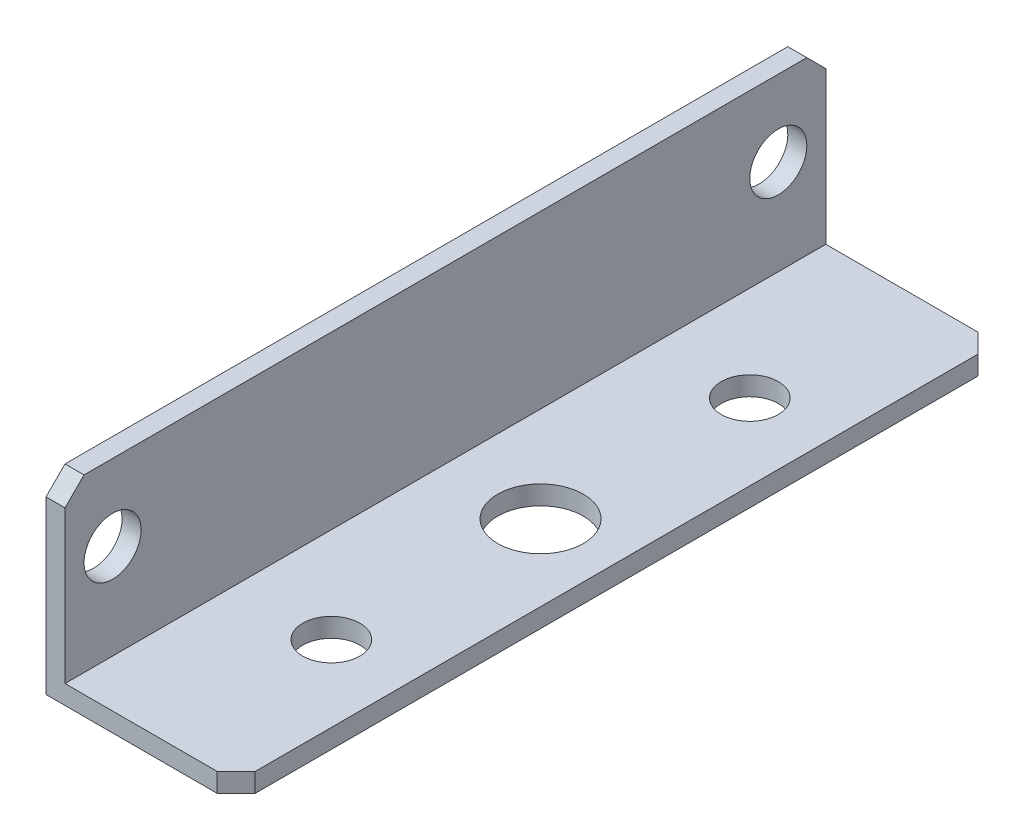
ISO-10303-21;
HEADER;
FILE_DESCRIPTION(('STEP AP214'),'2;1');
FILE_NAME('part.step','',(''),(''),'','','');
FILE_SCHEMA(('AUTOMOTIVE_DESIGN { 1 0 10303 214 1 1 1 1 }'));
ENDSEC;
DATA;
#1=APPLICATION_CONTEXT('core data for automotive mechanical design processes');
#2=APPLICATION_PROTOCOL_DEFINITION('international standard','automotive_design',2000,#1);
#3=PRODUCT_CONTEXT('',#1,'mechanical');
#4=PRODUCT('Part','Part','',(#3));
#5=PRODUCT_RELATED_PRODUCT_CATEGORY('part','',(#4));
#6=PRODUCT_DEFINITION_FORMATION('','',#4);
#7=PRODUCT_DEFINITION_CONTEXT('part definition',#1,'design');
#8=PRODUCT_DEFINITION('design','',#6,#7);
#9=PRODUCT_DEFINITION_SHAPE('','',#8);
#10=(LENGTH_UNIT() NAMED_UNIT(*) SI_UNIT(.MILLI.,.METRE.));
#11=(NAMED_UNIT(*) PLANE_ANGLE_UNIT() SI_UNIT($,.RADIAN.));
#12=(NAMED_UNIT(*) SI_UNIT($,.STERADIAN.) SOLID_ANGLE_UNIT());
#13=UNCERTAINTY_MEASURE_WITH_UNIT(LENGTH_MEASURE(1.E-05),#10,'distance_accuracy_value','');
#14=(GEOMETRIC_REPRESENTATION_CONTEXT(3) GLOBAL_UNCERTAINTY_ASSIGNED_CONTEXT((#13)) GLOBAL_UNIT_ASSIGNED_CONTEXT((#10,
#11,#12)) REPRESENTATION_CONTEXT('',''));
#15=CARTESIAN_POINT('',(0.,0.,0.));
#16=DIRECTION('',(0.,0.,1.));
#17=DIRECTION('',(1.,0.,0.));
#18=AXIS2_PLACEMENT_3D('',#15,#16,#17);
#19=CARTESIAN_POINT('',(0.,0.,20.));
#20=DIRECTION('',(0.,1.,0.));
#21=DIRECTION('',(0.,0.,1.));
#22=AXIS2_PLACEMENT_3D('',#19,#20,#21);
#23=PLANE('',#22);
#24=CARTESIAN_POINT('',(6.,0.,0.));
#25=DIRECTION('',(0.,1.,0.));
#26=DIRECTION('',(0.,0.,1.));
#27=AXIS2_PLACEMENT_3D('',#24,#25,#26);
#28=CIRCLE('',#27,2.25);
#29=CARTESIAN_POINT('',(6.,0.,2.25));
#30=VERTEX_POINT('',#29);
#31=EDGE_CURVE('E215',#30,#30,#28,.T.);
#32=ORIENTED_EDGE('',*,*,#31,.T.);
#33=EDGE_LOOP('',(#32));
#34=FACE_BOUND('',#33,.T.);
#35=CARTESIAN_POINT('',(6.,0.,-11.));
#36=DIRECTION('',(0.,1.,0.));
#37=DIRECTION('',(0.,0.,1.));
#38=AXIS2_PLACEMENT_3D('',#35,#36,#37);
#39=CIRCLE('',#38,1.5);
#40=CARTESIAN_POINT('',(6.,0.,-9.5));
#41=VERTEX_POINT('',#40);
#42=EDGE_CURVE('E209',#41,#41,#39,.T.);
#43=ORIENTED_EDGE('',*,*,#42,.T.);
#44=EDGE_LOOP('',(#43));
#45=FACE_BOUND('',#44,.T.);
#46=CARTESIAN_POINT('',(6.,0.,11.));
#47=DIRECTION('',(0.,1.,0.));
#48=DIRECTION('',(0.,0.,1.));
#49=AXIS2_PLACEMENT_3D('',#46,#47,#48);
#50=CIRCLE('',#49,1.5);
#51=CARTESIAN_POINT('',(6.,0.,12.5));
#52=VERTEX_POINT('',#51);
#53=EDGE_CURVE('E203',#52,#52,#50,.T.);
#54=ORIENTED_EDGE('',*,*,#53,.T.);
#55=EDGE_LOOP('',(#54));
#56=FACE_BOUND('',#55,.T.);
#57=DIRECTION('',(1.,0.,0.));
#58=VECTOR('',#57,1.);
#59=CARTESIAN_POINT('',(0.,0.,-20.));
#60=LINE('',#59,#58);
#61=CARTESIAN_POINT('',(0.,0.,-20.));
#62=VERTEX_POINT('',#61);
#63=CARTESIAN_POINT('',(9.,0.,-20.));
#64=VERTEX_POINT('',#63);
#65=EDGE_CURVE('E143',#62,#64,#60,.T.);
#66=ORIENTED_EDGE('',*,*,#65,.T.);
#67=DIRECTION('',(-0.707106781186545,0.,-0.70710678118655));
#68=VECTOR('',#67,1.);
#69=CARTESIAN_POINT('',(9.,0.,-20.));
#70=LINE('',#69,#68);
#71=CARTESIAN_POINT('',(10.,0.,-19.));
#72=VERTEX_POINT('',#71);
#73=EDGE_CURVE('E181',#64,#72,#70,.F.);
#74=ORIENTED_EDGE('',*,*,#73,.T.);
#75=DIRECTION('',(0.,0.,-1.));
#76=VECTOR('',#75,1.);
#77=CARTESIAN_POINT('',(10.,0.,20.));
#78=LINE('',#77,#76);
#79=CARTESIAN_POINT('',(10.,0.,19.));
#80=VERTEX_POINT('',#79);
#81=EDGE_CURVE('E159',#80,#72,#78,.T.);
#82=ORIENTED_EDGE('',*,*,#81,.F.);
#83=DIRECTION('',(-0.707106781186549,0.,0.707106781186546));
#84=VECTOR('',#83,1.);
#85=CARTESIAN_POINT('',(10.,0.,19.));
#86=LINE('',#85,#84);
#87=CARTESIAN_POINT('',(8.99999999999999,0.,20.));
#88=VERTEX_POINT('',#87);
#89=EDGE_CURVE('E179',#80,#88,#86,.T.);
#90=ORIENTED_EDGE('',*,*,#89,.T.);
#91=DIRECTION('',(1.,0.,0.));
#92=VECTOR('',#91,1.);
#93=CARTESIAN_POINT('',(0.,0.,20.));
#94=LINE('',#93,#92);
#95=CARTESIAN_POINT('',(0.,0.,20.));
#96=VERTEX_POINT('',#95);
#97=EDGE_CURVE('E135',#96,#88,#94,.T.);
#98=ORIENTED_EDGE('',*,*,#97,.F.);
#99=DIRECTION('',(0.,0.,-1.));
#100=VECTOR('',#99,1.);
#101=CARTESIAN_POINT('',(0.,0.,20.));
#102=LINE('',#101,#100);
#103=EDGE_CURVE('E142',#96,#62,#102,.T.);
#104=ORIENTED_EDGE('',*,*,#103,.T.);
#105=EDGE_LOOP('',(#66,#74,#82,#90,#98,#104));
#106=FACE_BOUND('',#105,.T.);
#107=ADVANCED_FACE('F33',(#34,#45,#56,#106),#23,.F.);
#108=CARTESIAN_POINT('',(10.,1.,20.));
#109=DIRECTION('',(1.,0.,0.));
#110=DIRECTION('',(0.,0.,-1.));
#111=AXIS2_PLACEMENT_3D('',#108,#109,#110);
#112=PLANE('',#111);
#113=ORIENTED_EDGE('',*,*,#81,.T.);
#114=DIRECTION('',(0.,1.,0.));
#115=VECTOR('',#114,1.);
#116=CARTESIAN_POINT('',(10.,1.,-19.));
#117=LINE('',#116,#115);
#118=CARTESIAN_POINT('',(10.,1.,-19.));
#119=VERTEX_POINT('',#118);
#120=EDGE_CURVE('E56',#72,#119,#117,.T.);
#121=ORIENTED_EDGE('',*,*,#120,.T.);
#122=DIRECTION('',(0.,0.,-1.));
#123=VECTOR('',#122,1.);
#124=CARTESIAN_POINT('',(10.,1.,20.));
#125=LINE('',#124,#123);
#126=CARTESIAN_POINT('',(10.,1.,19.));
#127=VERTEX_POINT('',#126);
#128=EDGE_CURVE('E131',#127,#119,#125,.T.);
#129=ORIENTED_EDGE('',*,*,#128,.F.);
#130=DIRECTION('',(0.,-1.,0.));
#131=VECTOR('',#130,1.);
#132=CARTESIAN_POINT('',(10.,0.,19.));
#133=LINE('',#132,#131);
#134=EDGE_CURVE('E183',#127,#80,#133,.T.);
#135=ORIENTED_EDGE('',*,*,#134,.T.);
#136=EDGE_LOOP('',(#113,#121,#129,#135));
#137=FACE_BOUND('',#136,.T.);
#138=ADVANCED_FACE('F227',(#137),#112,.T.);
#139=CARTESIAN_POINT('',(0.,1.,20.));
#140=DIRECTION('',(0.,1.,0.));
#141=DIRECTION('',(0.,0.,1.));
#142=AXIS2_PLACEMENT_3D('',#139,#140,#141);
#143=PLANE('',#142);
#144=CARTESIAN_POINT('',(6.,1.,0.));
#145=DIRECTION('',(0.,1.,0.));
#146=DIRECTION('',(0.,0.,1.));
#147=AXIS2_PLACEMENT_3D('',#144,#145,#146);
#148=CIRCLE('',#147,2.25);
#149=CARTESIAN_POINT('',(6.,1.,2.25));
#150=VERTEX_POINT('',#149);
#151=EDGE_CURVE('E218',#150,#150,#148,.T.);
#152=ORIENTED_EDGE('',*,*,#151,.F.);
#153=EDGE_LOOP('',(#152));
#154=FACE_BOUND('',#153,.T.);
#155=CARTESIAN_POINT('',(6.,1.,-11.));
#156=DIRECTION('',(0.,1.,0.));
#157=DIRECTION('',(0.,0.,1.));
#158=AXIS2_PLACEMENT_3D('',#155,#156,#157);
#159=CIRCLE('',#158,1.5);
#160=CARTESIAN_POINT('',(6.,1.,-9.5));
#161=VERTEX_POINT('',#160);
#162=EDGE_CURVE('E212',#161,#161,#159,.T.);
#163=ORIENTED_EDGE('',*,*,#162,.F.);
#164=EDGE_LOOP('',(#163));
#165=FACE_BOUND('',#164,.T.);
#166=CARTESIAN_POINT('',(6.,1.,11.));
#167=DIRECTION('',(0.,1.,0.));
#168=DIRECTION('',(0.,0.,1.));
#169=AXIS2_PLACEMENT_3D('',#166,#167,#168);
#170=CIRCLE('',#169,1.5);
#171=CARTESIAN_POINT('',(6.,1.,12.5));
#172=VERTEX_POINT('',#171);
#173=EDGE_CURVE('E206',#172,#172,#170,.T.);
#174=ORIENTED_EDGE('',*,*,#173,.F.);
#175=EDGE_LOOP('',(#174));
#176=FACE_BOUND('',#175,.T.);
#177=ORIENTED_EDGE('',*,*,#128,.T.);
#178=DIRECTION('',(0.707106781186545,0.,0.70710678118655));
#179=VECTOR('',#178,1.);
#180=CARTESIAN_POINT('',(24.5,1.,-4.49999999999986));
#181=LINE('',#180,#179);
#182=CARTESIAN_POINT('',(8.99999999999999,1.,-20.));
#183=VERTEX_POINT('',#182);
#184=EDGE_CURVE('E189',#119,#183,#181,.F.);
#185=ORIENTED_EDGE('',*,*,#184,.T.);
#186=DIRECTION('',(1.,0.,0.));
#187=VECTOR('',#186,1.);
#188=CARTESIAN_POINT('',(0.,1.,-20.));
#189=LINE('',#188,#187);
#190=CARTESIAN_POINT('',(1.,1.,-20.));
#191=VERTEX_POINT('',#190);
#192=EDGE_CURVE('E130',#191,#183,#189,.T.);
#193=ORIENTED_EDGE('',*,*,#192,.F.);
#194=DIRECTION('',(0.,0.,-1.));
#195=VECTOR('',#194,1.);
#196=CARTESIAN_POINT('',(1.,1.,20.));
#197=LINE('',#196,#195);
#198=CARTESIAN_POINT('',(1.,1.,20.));
#199=VERTEX_POINT('',#198);
#200=EDGE_CURVE('E118',#199,#191,#197,.T.);
#201=ORIENTED_EDGE('',*,*,#200,.F.);
#202=DIRECTION('',(1.,0.,0.));
#203=VECTOR('',#202,1.);
#204=CARTESIAN_POINT('',(0.,1.,20.));
#205=LINE('',#204,#203);
#206=CARTESIAN_POINT('',(8.99999999999999,1.,20.));
#207=VERTEX_POINT('',#206);
#208=EDGE_CURVE('E124',#199,#207,#205,.T.);
#209=ORIENTED_EDGE('',*,*,#208,.T.);
#210=DIRECTION('',(0.707106781186549,0.,-0.707106781186546));
#211=VECTOR('',#210,1.);
#212=CARTESIAN_POINT('',(4.49999999999998,1.,24.5));
#213=LINE('',#212,#211);
#214=EDGE_CURVE('E187',#207,#127,#213,.T.);
#215=ORIENTED_EDGE('',*,*,#214,.T.);
#216=EDGE_LOOP('',(#177,#185,#193,#201,#209,#215));
#217=FACE_BOUND('',#216,.T.);
#218=ADVANCED_FACE('F127',(#154,#165,#176,#217),#143,.T.);
#219=CARTESIAN_POINT('',(1.,10.,20.));
#220=DIRECTION('',(1.,0.,0.));
#221=DIRECTION('',(0.,1.,0.));
#222=AXIS2_PLACEMENT_3D('',#219,#220,#221);
#223=PLANE('',#222);
#224=CARTESIAN_POINT('',(1.,6.,-17.5));
#225=DIRECTION('',(1.,0.,0.));
#226=DIRECTION('',(0.,1.,0.));
#227=AXIS2_PLACEMENT_3D('',#224,#225,#226);
#228=CIRCLE('',#227,1.5);
#229=CARTESIAN_POINT('',(1.,7.5,-17.5));
#230=VERTEX_POINT('',#229);
#231=EDGE_CURVE('E199',#230,#230,#228,.T.);
#232=ORIENTED_EDGE('',*,*,#231,.F.);
#233=EDGE_LOOP('',(#232));
#234=FACE_BOUND('',#233,.T.);
#235=CARTESIAN_POINT('',(1.,6.,17.5));
#236=DIRECTION('',(1.,0.,0.));
#237=DIRECTION('',(0.,1.,0.));
#238=AXIS2_PLACEMENT_3D('',#235,#236,#237);
#239=CIRCLE('',#238,1.5);
#240=CARTESIAN_POINT('',(1.,7.5,17.5));
#241=VERTEX_POINT('',#240);
#242=EDGE_CURVE('E192',#241,#241,#239,.T.);
#243=ORIENTED_EDGE('',*,*,#242,.F.);
#244=EDGE_LOOP('',(#243));
#245=FACE_BOUND('',#244,.T.);
#246=DIRECTION('',(0.,-1.,0.));
#247=VECTOR('',#246,1.);
#248=CARTESIAN_POINT('',(1.,10.,-20.));
#249=LINE('',#248,#247);
#250=CARTESIAN_POINT('',(1.,8.99999999999999,-20.));
#251=VERTEX_POINT('',#250);
#252=EDGE_CURVE('E148',#251,#191,#249,.T.);
#253=ORIENTED_EDGE('',*,*,#252,.F.);
#254=DIRECTION('',(0.,-0.707106781186545,-0.70710678118655));
#255=VECTOR('',#254,1.);
#256=CARTESIAN_POINT('',(1.00000000000001,29.5,0.500000000000143));
#257=LINE('',#256,#255);
#258=CARTESIAN_POINT('',(1.,10.,-19.));
#259=VERTEX_POINT('',#258);
#260=EDGE_CURVE('E168',#251,#259,#257,.F.);
#261=ORIENTED_EDGE('',*,*,#260,.T.);
#262=DIRECTION('',(0.,0.,-1.));
#263=VECTOR('',#262,1.);
#264=CARTESIAN_POINT('',(1.,10.,20.));
#265=LINE('',#264,#263);
#266=CARTESIAN_POINT('',(1.,10.,19.));
#267=VERTEX_POINT('',#266);
#268=EDGE_CURVE('E132',#267,#259,#265,.T.);
#269=ORIENTED_EDGE('',*,*,#268,.F.);
#270=DIRECTION('',(0.,-0.707106781186549,0.707106781186546));
#271=VECTOR('',#270,1.);
#272=CARTESIAN_POINT('',(1.,9.5,19.5));
#273=LINE('',#272,#271);
#274=CARTESIAN_POINT('',(1.,8.99999999999999,20.));
#275=VERTEX_POINT('',#274);
#276=EDGE_CURVE('E121',#267,#275,#273,.T.);
#277=ORIENTED_EDGE('',*,*,#276,.T.);
#278=DIRECTION('',(0.,-1.,0.));
#279=VECTOR('',#278,1.);
#280=CARTESIAN_POINT('',(1.,10.,20.));
#281=LINE('',#280,#279);
#282=EDGE_CURVE('E114',#275,#199,#281,.T.);
#283=ORIENTED_EDGE('',*,*,#282,.T.);
#284=ORIENTED_EDGE('',*,*,#200,.T.);
#285=EDGE_LOOP('',(#253,#261,#269,#277,#283,#284));
#286=FACE_BOUND('',#285,.T.);
#287=ADVANCED_FACE('F117',(#234,#245,#286),#223,.T.);
#288=CARTESIAN_POINT('',(0.,10.,20.));
#289=DIRECTION('',(0.,1.,0.));
#290=DIRECTION('',(0.,0.,1.));
#291=AXIS2_PLACEMENT_3D('',#288,#289,#290);
#292=PLANE('',#291);
#293=ORIENTED_EDGE('',*,*,#268,.T.);
#294=DIRECTION('',(-1.,0.,0.));
#295=VECTOR('',#294,1.);
#296=CARTESIAN_POINT('',(0.,10.,-19.));
#297=LINE('',#296,#295);
#298=CARTESIAN_POINT('',(0.,10.,-19.));
#299=VERTEX_POINT('',#298);
#300=EDGE_CURVE('E173',#259,#299,#297,.T.);
#301=ORIENTED_EDGE('',*,*,#300,.T.);
#302=DIRECTION('',(0.,0.,-1.));
#303=VECTOR('',#302,1.);
#304=CARTESIAN_POINT('',(0.,10.,20.));
#305=LINE('',#304,#303);
#306=CARTESIAN_POINT('',(0.,10.,19.));
#307=VERTEX_POINT('',#306);
#308=EDGE_CURVE('E153',#307,#299,#305,.T.);
#309=ORIENTED_EDGE('',*,*,#308,.F.);
#310=DIRECTION('',(1.,0.,0.));
#311=VECTOR('',#310,1.);
#312=CARTESIAN_POINT('',(1.,10.,19.));
#313=LINE('',#312,#311);
#314=EDGE_CURVE('E170',#307,#267,#313,.T.);
#315=ORIENTED_EDGE('',*,*,#314,.T.);
#316=EDGE_LOOP('',(#293,#301,#309,#315));
#317=FACE_BOUND('',#316,.T.);
#318=ADVANCED_FACE('F270',(#317),#292,.T.);
#319=CARTESIAN_POINT('',(0.,10.,20.));
#320=DIRECTION('',(1.,0.,0.));
#321=DIRECTION('',(0.,1.,0.));
#322=AXIS2_PLACEMENT_3D('',#319,#320,#321);
#323=PLANE('',#322);
#324=CARTESIAN_POINT('',(0.,6.,-17.5));
#325=DIRECTION('',(1.,0.,0.));
#326=DIRECTION('',(0.,1.,0.));
#327=AXIS2_PLACEMENT_3D('',#324,#325,#326);
#328=CIRCLE('',#327,1.5);
#329=CARTESIAN_POINT('',(0.,7.5,-17.5));
#330=VERTEX_POINT('',#329);
#331=EDGE_CURVE('E37',#330,#330,#328,.T.);
#332=ORIENTED_EDGE('',*,*,#331,.T.);
#333=EDGE_LOOP('',(#332));
#334=FACE_BOUND('',#333,.T.);
#335=CARTESIAN_POINT('',(0.,6.,17.5));
#336=DIRECTION('',(1.,0.,0.));
#337=DIRECTION('',(0.,1.,0.));
#338=AXIS2_PLACEMENT_3D('',#335,#336,#337);
#339=CIRCLE('',#338,1.5);
#340=CARTESIAN_POINT('',(0.,7.5,17.5));
#341=VERTEX_POINT('',#340);
#342=EDGE_CURVE('E146',#341,#341,#339,.T.);
#343=ORIENTED_EDGE('',*,*,#342,.T.);
#344=EDGE_LOOP('',(#343));
#345=FACE_BOUND('',#344,.T.);
#346=ORIENTED_EDGE('',*,*,#308,.T.);
#347=DIRECTION('',(0.,0.707106781186545,0.70710678118655));
#348=VECTOR('',#347,1.);
#349=CARTESIAN_POINT('',(0.,9.,-20.));
#350=LINE('',#349,#348);
#351=CARTESIAN_POINT('',(0.,9.,-20.));
#352=VERTEX_POINT('',#351);
#353=EDGE_CURVE('E177',#299,#352,#350,.F.);
#354=ORIENTED_EDGE('',*,*,#353,.T.);
#355=DIRECTION('',(0.,-1.,0.));
#356=VECTOR('',#355,1.);
#357=CARTESIAN_POINT('',(0.,10.,-20.));
#358=LINE('',#357,#356);
#359=EDGE_CURVE('E137',#352,#62,#358,.T.);
#360=ORIENTED_EDGE('',*,*,#359,.T.);
#361=ORIENTED_EDGE('',*,*,#103,.F.);
#362=DIRECTION('',(0.,-1.,0.));
#363=VECTOR('',#362,1.);
#364=CARTESIAN_POINT('',(0.,10.,20.));
#365=LINE('',#364,#363);
#366=CARTESIAN_POINT('',(0.,8.99999999999999,20.));
#367=VERTEX_POINT('',#366);
#368=EDGE_CURVE('E123',#367,#96,#365,.T.);
#369=ORIENTED_EDGE('',*,*,#368,.F.);
#370=DIRECTION('',(0.,0.707106781186549,-0.707106781186546));
#371=VECTOR('',#370,1.);
#372=CARTESIAN_POINT('',(0.,10.,19.));
#373=LINE('',#372,#371);
#374=EDGE_CURVE('E175',#367,#307,#373,.T.);
#375=ORIENTED_EDGE('',*,*,#374,.T.);
#376=EDGE_LOOP('',(#346,#354,#360,#361,#369,#375));
#377=FACE_BOUND('',#376,.T.);
#378=ADVANCED_FACE('F263',(#334,#345,#377),#323,.F.);
#379=CARTESIAN_POINT('',(10.,0.,20.));
#380=DIRECTION('',(0.,0.,-1.));
#381=DIRECTION('',(-1.,0.,0.));
#382=AXIS2_PLACEMENT_3D('',#379,#380,#381);
#383=PLANE('',#382);
#384=ORIENTED_EDGE('',*,*,#97,.T.);
#385=DIRECTION('',(0.,1.,0.));
#386=VECTOR('',#385,1.);
#387=CARTESIAN_POINT('',(8.99999999999999,1.,20.));
#388=LINE('',#387,#386);
#389=EDGE_CURVE('E11',#88,#207,#388,.T.);
#390=ORIENTED_EDGE('',*,*,#389,.T.);
#391=ORIENTED_EDGE('',*,*,#208,.F.);
#392=ORIENTED_EDGE('',*,*,#282,.F.);
#393=DIRECTION('',(-1.,0.,0.));
#394=VECTOR('',#393,1.);
#395=CARTESIAN_POINT('',(0.,8.99999999999999,20.));
#396=LINE('',#395,#394);
#397=EDGE_CURVE('E42',#275,#367,#396,.T.);
#398=ORIENTED_EDGE('',*,*,#397,.T.);
#399=ORIENTED_EDGE('',*,*,#368,.T.);
#400=EDGE_LOOP('',(#384,#390,#391,#392,#398,#399));
#401=FACE_BOUND('',#400,.T.);
#402=ADVANCED_FACE('F134',(#401),#383,.F.);
#403=CARTESIAN_POINT('',(10.,0.,-20.));
#404=DIRECTION('',(0.,0.,-1.));
#405=DIRECTION('',(-1.,0.,0.));
#406=AXIS2_PLACEMENT_3D('',#403,#404,#405);
#407=PLANE('',#406);
#408=ORIENTED_EDGE('',*,*,#359,.F.);
#409=DIRECTION('',(1.,0.,0.));
#410=VECTOR('',#409,1.);
#411=CARTESIAN_POINT('',(10.,9.,-20.));
#412=LINE('',#411,#410);
#413=EDGE_CURVE('E164',#352,#251,#412,.T.);
#414=ORIENTED_EDGE('',*,*,#413,.T.);
#415=ORIENTED_EDGE('',*,*,#252,.T.);
#416=ORIENTED_EDGE('',*,*,#192,.T.);
#417=DIRECTION('',(0.,-1.,0.));
#418=VECTOR('',#417,1.);
#419=CARTESIAN_POINT('',(9.,0.,-20.));
#420=LINE('',#419,#418);
#421=EDGE_CURVE('E161',#183,#64,#420,.T.);
#422=ORIENTED_EDGE('',*,*,#421,.T.);
#423=ORIENTED_EDGE('',*,*,#65,.F.);
#424=EDGE_LOOP('',(#408,#414,#415,#416,#422,#423));
#425=FACE_BOUND('',#424,.T.);
#426=ADVANCED_FACE('F251',(#425),#407,.T.);
#427=CARTESIAN_POINT('',(10.,9.,-20.));
#428=DIRECTION('',(0.,-0.70710678118655,0.707106781186545));
#429=DIRECTION('',(0.,-0.707106781186545,-0.70710678118655));
#430=AXIS2_PLACEMENT_3D('',#427,#428,#429);
#431=PLANE('',#430);
#432=ORIENTED_EDGE('',*,*,#353,.F.);
#433=ORIENTED_EDGE('',*,*,#300,.F.);
#434=ORIENTED_EDGE('',*,*,#260,.F.);
#435=ORIENTED_EDGE('',*,*,#413,.F.);
#436=EDGE_LOOP('',(#432,#433,#434,#435));
#437=FACE_BOUND('',#436,.T.);
#438=ADVANCED_FACE('F268',(#437),#431,.F.);
#439=CARTESIAN_POINT('',(9.,0.,-20.));
#440=DIRECTION('',(-0.70710678118655,0.,0.707106781186545));
#441=DIRECTION('',(0.707106781186545,0.,0.70710678118655));
#442=AXIS2_PLACEMENT_3D('',#439,#440,#441);
#443=PLANE('',#442);
#444=ORIENTED_EDGE('',*,*,#184,.F.);
#445=ORIENTED_EDGE('',*,*,#120,.F.);
#446=ORIENTED_EDGE('',*,*,#73,.F.);
#447=ORIENTED_EDGE('',*,*,#421,.F.);
#448=EDGE_LOOP('',(#444,#445,#446,#447));
#449=FACE_BOUND('',#448,.T.);
#450=ADVANCED_FACE('F256',(#449),#443,.F.);
#451=CARTESIAN_POINT('',(10.,1.,19.));
#452=DIRECTION('',(0.707106781186546,0.,0.707106781186549));
#453=DIRECTION('',(0.707106781186549,0.,-0.707106781186546));
#454=AXIS2_PLACEMENT_3D('',#451,#452,#453);
#455=PLANE('',#454);
#456=ORIENTED_EDGE('',*,*,#214,.F.);
#457=ORIENTED_EDGE('',*,*,#389,.F.);
#458=ORIENTED_EDGE('',*,*,#89,.F.);
#459=ORIENTED_EDGE('',*,*,#134,.F.);
#460=EDGE_LOOP('',(#456,#457,#458,#459));
#461=FACE_BOUND('',#460,.T.);
#462=ADVANCED_FACE('F259',(#461),#455,.T.);
#463=CARTESIAN_POINT('',(0.,10.,19.));
#464=DIRECTION('',(0.,0.707106781186546,0.707106781186549));
#465=DIRECTION('',(0.,-0.707106781186549,0.707106781186546));
#466=AXIS2_PLACEMENT_3D('',#463,#464,#465);
#467=PLANE('',#466);
#468=ORIENTED_EDGE('',*,*,#374,.F.);
#469=ORIENTED_EDGE('',*,*,#397,.F.);
#470=ORIENTED_EDGE('',*,*,#276,.F.);
#471=ORIENTED_EDGE('',*,*,#314,.F.);
#472=EDGE_LOOP('',(#468,#469,#470,#471));
#473=FACE_BOUND('',#472,.T.);
#474=ADVANCED_FACE('F35',(#473),#467,.T.);
#475=CARTESIAN_POINT('',(-9.,6.,17.5));
#476=DIRECTION('',(1.,0.,0.));
#477=DIRECTION('',(0.,1.,0.));
#478=AXIS2_PLACEMENT_3D('',#475,#476,#477);
#479=CYLINDRICAL_SURFACE('',#478,1.5);
#480=ORIENTED_EDGE('',*,*,#242,.T.);
#481=EDGE_LOOP('',(#480));
#482=FACE_BOUND('',#481,.T.);
#483=ORIENTED_EDGE('',*,*,#342,.F.);
#484=EDGE_LOOP('',(#483));
#485=FACE_BOUND('',#484,.T.);
#486=ADVANCED_FACE('F274',(#482,#485),#479,.F.);
#487=CARTESIAN_POINT('',(-9.,6.,-17.5));
#488=DIRECTION('',(1.,0.,0.));
#489=DIRECTION('',(0.,1.,0.));
#490=AXIS2_PLACEMENT_3D('',#487,#488,#489);
#491=CYLINDRICAL_SURFACE('',#490,1.5);
#492=ORIENTED_EDGE('',*,*,#231,.T.);
#493=EDGE_LOOP('',(#492));
#494=FACE_BOUND('',#493,.T.);
#495=ORIENTED_EDGE('',*,*,#331,.F.);
#496=EDGE_LOOP('',(#495));
#497=FACE_BOUND('',#496,.T.);
#498=ADVANCED_FACE('F237',(#494,#497),#491,.F.);
#499=CARTESIAN_POINT('',(6.,-9.,11.));
#500=DIRECTION('',(0.,1.,0.));
#501=DIRECTION('',(0.,0.,1.));
#502=AXIS2_PLACEMENT_3D('',#499,#500,#501);
#503=CYLINDRICAL_SURFACE('',#502,1.5);
#504=ORIENTED_EDGE('',*,*,#173,.T.);
#505=EDGE_LOOP('',(#504));
#506=FACE_BOUND('',#505,.T.);
#507=ORIENTED_EDGE('',*,*,#53,.F.);
#508=EDGE_LOOP('',(#507));
#509=FACE_BOUND('',#508,.T.);
#510=ADVANCED_FACE('F233',(#506,#509),#503,.F.);
#511=CARTESIAN_POINT('',(6.,-9.,-11.));
#512=DIRECTION('',(0.,1.,0.));
#513=DIRECTION('',(0.,0.,1.));
#514=AXIS2_PLACEMENT_3D('',#511,#512,#513);
#515=CYLINDRICAL_SURFACE('',#514,1.5);
#516=ORIENTED_EDGE('',*,*,#162,.T.);
#517=EDGE_LOOP('',(#516));
#518=FACE_BOUND('',#517,.T.);
#519=ORIENTED_EDGE('',*,*,#42,.F.);
#520=EDGE_LOOP('',(#519));
#521=FACE_BOUND('',#520,.T.);
#522=ADVANCED_FACE('F236',(#518,#521),#515,.F.);
#523=CARTESIAN_POINT('',(6.,-9.,0.));
#524=DIRECTION('',(0.,1.,0.));
#525=DIRECTION('',(0.,0.,1.));
#526=AXIS2_PLACEMENT_3D('',#523,#524,#525);
#527=CYLINDRICAL_SURFACE('',#526,2.25);
#528=ORIENTED_EDGE('',*,*,#151,.T.);
#529=EDGE_LOOP('',(#528));
#530=FACE_BOUND('',#529,.T.);
#531=ORIENTED_EDGE('',*,*,#31,.F.);
#532=EDGE_LOOP('',(#531));
#533=FACE_BOUND('',#532,.T.);
#534=ADVANCED_FACE('F222',(#530,#533),#527,.F.);
#535=CLOSED_SHELL('',(#107,#138,#218,#287,#318,#378,#402,#426,#438,#450,#462,#474,#486,#498,
#510,#522,#534));
#536=MANIFOLD_SOLID_BREP('B2',#535);
#537=ADVANCED_BREP_SHAPE_REPRESENTATION('',(#18,#536),#14);
#538=SHAPE_DEFINITION_REPRESENTATION(#9,#537);
ENDSEC;
END-ISO-10303-21;
